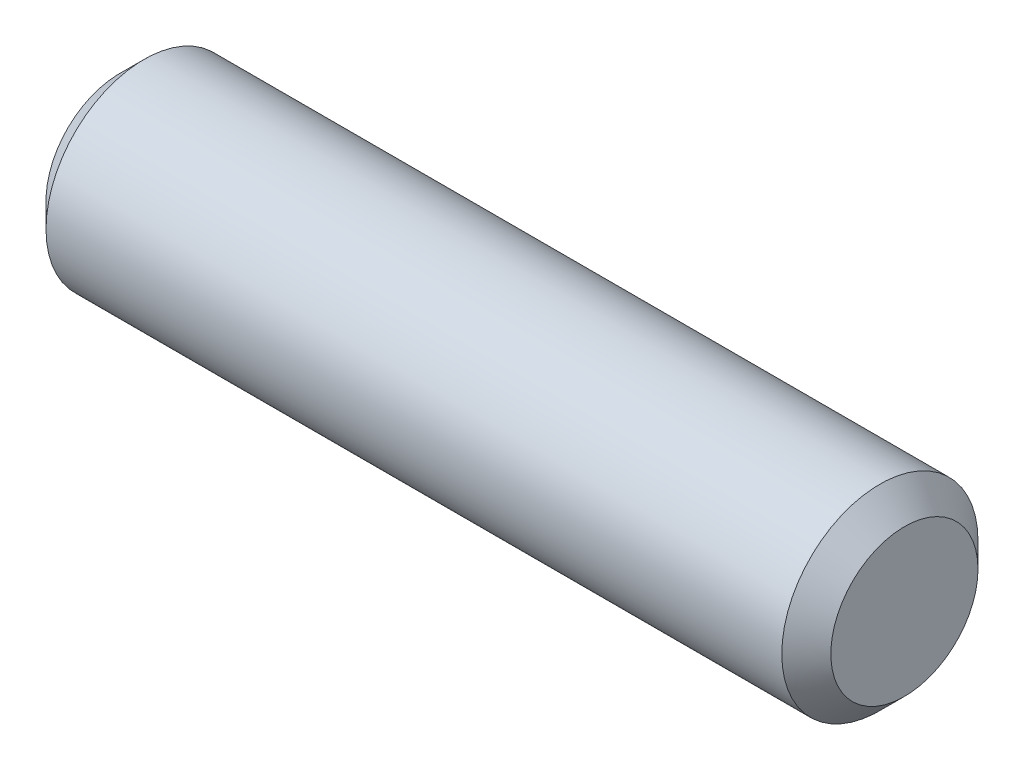
ISO-10303-21;
HEADER;
FILE_DESCRIPTION(('STEP AP214'),'2;1');
FILE_NAME('part.step','',(''),(''),'','','');
FILE_SCHEMA(('AUTOMOTIVE_DESIGN { 1 0 10303 214 1 1 1 1 }'));
ENDSEC;
DATA;
#1=APPLICATION_CONTEXT('core data for automotive mechanical design processes');
#2=APPLICATION_PROTOCOL_DEFINITION('international standard','automotive_design',2000,#1);
#3=PRODUCT_CONTEXT('',#1,'mechanical');
#4=PRODUCT('Part','Part','',(#3));
#5=PRODUCT_RELATED_PRODUCT_CATEGORY('part','',(#4));
#6=PRODUCT_DEFINITION_FORMATION('','',#4);
#7=PRODUCT_DEFINITION_CONTEXT('part definition',#1,'design');
#8=PRODUCT_DEFINITION('design','',#6,#7);
#9=PRODUCT_DEFINITION_SHAPE('','',#8);
#10=(LENGTH_UNIT() NAMED_UNIT(*) SI_UNIT(.MILLI.,.METRE.));
#11=(NAMED_UNIT(*) PLANE_ANGLE_UNIT() SI_UNIT($,.RADIAN.));
#12=(NAMED_UNIT(*) SI_UNIT($,.STERADIAN.) SOLID_ANGLE_UNIT());
#13=UNCERTAINTY_MEASURE_WITH_UNIT(LENGTH_MEASURE(1.E-05),#10,'distance_accuracy_value','');
#14=(GEOMETRIC_REPRESENTATION_CONTEXT(3) GLOBAL_UNCERTAINTY_ASSIGNED_CONTEXT((#13)) GLOBAL_UNIT_ASSIGNED_CONTEXT((#10,
#11,#12)) REPRESENTATION_CONTEXT('',''));
#15=CARTESIAN_POINT('',(0.,0.,0.));
#16=DIRECTION('',(0.,0.,1.));
#17=DIRECTION('',(1.,0.,0.));
#18=AXIS2_PLACEMENT_3D('',#15,#16,#17);
#19=CARTESIAN_POINT('',(16.,0.,0.));
#20=DIRECTION('',(-1.,0.,0.));
#21=DIRECTION('',(0.,0.,1.));
#22=AXIS2_PLACEMENT_3D('',#19,#20,#21);
#23=CYLINDRICAL_SURFACE('',#22,4.);
#24=CARTESIAN_POINT('',(15.,0.,0.));
#25=DIRECTION('',(1.,0.,0.));
#26=DIRECTION('',(0.,0.,-1.));
#27=AXIS2_PLACEMENT_3D('',#24,#25,#26);
#28=CIRCLE('',#27,4.);
#29=CARTESIAN_POINT('',(15.,0.,-4.));
#30=VERTEX_POINT('',#29);
#31=EDGE_CURVE('E43',#30,#30,#28,.F.);
#32=ORIENTED_EDGE('',*,*,#31,.T.);
#33=EDGE_LOOP('',(#32));
#34=FACE_BOUND('',#33,.T.);
#35=CARTESIAN_POINT('',(-15.,0.,0.));
#36=DIRECTION('',(1.,0.,0.));
#37=DIRECTION('',(0.,0.,-1.));
#38=AXIS2_PLACEMENT_3D('',#35,#36,#37);
#39=CIRCLE('',#38,4.);
#40=CARTESIAN_POINT('',(-15.,0.,-4.));
#41=VERTEX_POINT('',#40);
#42=EDGE_CURVE('E47',#41,#41,#39,.T.);
#43=ORIENTED_EDGE('',*,*,#42,.T.);
#44=EDGE_LOOP('',(#43));
#45=FACE_BOUND('',#44,.T.);
#46=ADVANCED_FACE('F35',(#34,#45),#23,.T.);
#47=CARTESIAN_POINT('',(16.,0.,0.));
#48=DIRECTION('',(1.,0.,0.));
#49=DIRECTION('',(0.,0.,-1.));
#50=AXIS2_PLACEMENT_3D('',#47,#48,#49);
#51=PLANE('',#50);
#52=CARTESIAN_POINT('',(16.,0.,0.));
#53=DIRECTION('',(1.,0.,0.));
#54=DIRECTION('',(0.,0.,-1.));
#55=AXIS2_PLACEMENT_3D('',#52,#53,#54);
#56=CIRCLE('',#55,3.);
#57=CARTESIAN_POINT('',(16.,0.,-3.));
#58=VERTEX_POINT('',#57);
#59=EDGE_CURVE('E51',#58,#58,#56,.T.);
#60=ORIENTED_EDGE('',*,*,#59,.T.);
#61=EDGE_LOOP('',(#60));
#62=FACE_BOUND('',#61,.T.);
#63=ADVANCED_FACE('F57',(#62),#51,.T.);
#64=CARTESIAN_POINT('',(-16.,0.,0.));
#65=DIRECTION('',(1.,0.,0.));
#66=DIRECTION('',(0.,0.,-1.));
#67=AXIS2_PLACEMENT_3D('',#64,#65,#66);
#68=PLANE('',#67);
#69=CARTESIAN_POINT('',(-16.,0.,0.));
#70=DIRECTION('',(1.,0.,0.));
#71=DIRECTION('',(0.,0.,-1.));
#72=AXIS2_PLACEMENT_3D('',#69,#70,#71);
#73=CIRCLE('',#72,2.99999999999999);
#74=CARTESIAN_POINT('',(-16.,0.,-2.99999999999999));
#75=VERTEX_POINT('',#74);
#76=EDGE_CURVE('E10',#75,#75,#73,.F.);
#77=ORIENTED_EDGE('',*,*,#76,.T.);
#78=EDGE_LOOP('',(#77));
#79=FACE_BOUND('',#78,.T.);
#80=ADVANCED_FACE('F61',(#79),#68,.F.);
#81=CARTESIAN_POINT('',(16.,0.,0.));
#82=DIRECTION('',(-1.,0.,0.));
#83=DIRECTION('',(0.,0.,1.));
#84=AXIS2_PLACEMENT_3D('',#81,#82,#83);
#85=CONICAL_SURFACE('',#84,3.,0.785398163397447);
#86=ORIENTED_EDGE('',*,*,#31,.F.);
#87=EDGE_LOOP('',(#86));
#88=FACE_BOUND('',#87,.T.);
#89=ORIENTED_EDGE('',*,*,#59,.F.);
#90=EDGE_LOOP('',(#89));
#91=FACE_BOUND('',#90,.T.);
#92=ADVANCED_FACE('F59',(#88,#91),#85,.T.);
#93=CARTESIAN_POINT('',(-15.,0.,0.));
#94=DIRECTION('',(1.,0.,0.));
#95=DIRECTION('',(0.,0.,-1.));
#96=AXIS2_PLACEMENT_3D('',#93,#94,#95);
#97=CONICAL_SURFACE('',#96,4.,0.785398163397452);
#98=ORIENTED_EDGE('',*,*,#76,.F.);
#99=EDGE_LOOP('',(#98));
#100=FACE_BOUND('',#99,.T.);
#101=ORIENTED_EDGE('',*,*,#42,.F.);
#102=EDGE_LOOP('',(#101));
#103=FACE_BOUND('',#102,.T.);
#104=ADVANCED_FACE('F38',(#100,#103),#97,.T.);
#105=CLOSED_SHELL('',(#46,#63,#80,#92,#104));
#106=MANIFOLD_SOLID_BREP('B2',#105);
#107=ADVANCED_BREP_SHAPE_REPRESENTATION('',(#18,#106),#14);
#108=SHAPE_DEFINITION_REPRESENTATION(#9,#107);
ENDSEC;
END-ISO-10303-21;
